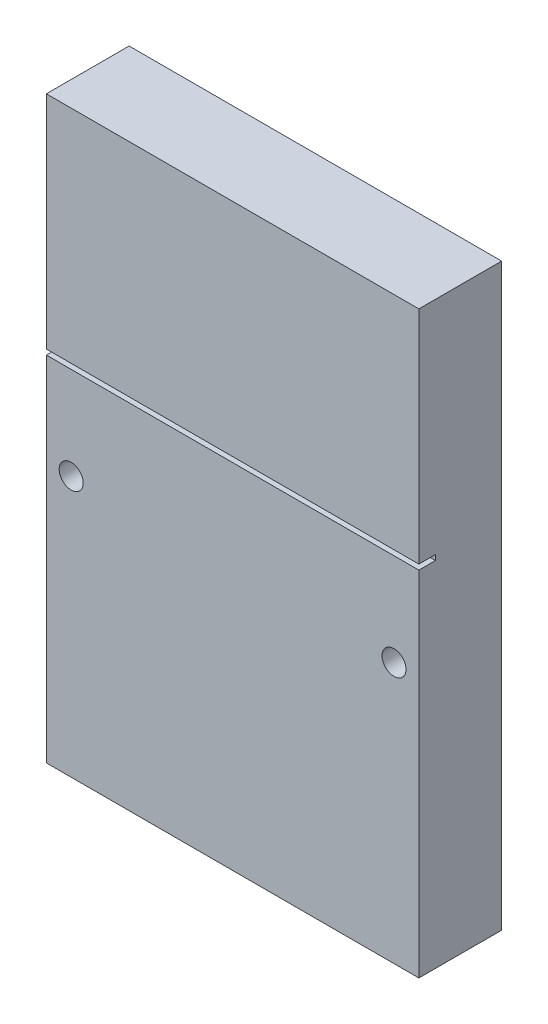
ISO-10303-21;
HEADER;
FILE_DESCRIPTION(('STEP AP214'),'2;1');
FILE_NAME('part.step','',(''),(''),'','','');
FILE_SCHEMA(('AUTOMOTIVE_DESIGN { 1 0 10303 214 1 1 1 1 }'));
ENDSEC;
DATA;
#1=APPLICATION_CONTEXT('core data for automotive mechanical design processes');
#2=APPLICATION_PROTOCOL_DEFINITION('international standard','automotive_design',2000,#1);
#3=PRODUCT_CONTEXT('',#1,'mechanical');
#4=PRODUCT('Part','Part','',(#3));
#5=PRODUCT_RELATED_PRODUCT_CATEGORY('part','',(#4));
#6=PRODUCT_DEFINITION_FORMATION('','',#4);
#7=PRODUCT_DEFINITION_CONTEXT('part definition',#1,'design');
#8=PRODUCT_DEFINITION('design','',#6,#7);
#9=PRODUCT_DEFINITION_SHAPE('','',#8);
#10=(LENGTH_UNIT() NAMED_UNIT(*) SI_UNIT(.MILLI.,.METRE.));
#11=(NAMED_UNIT(*) PLANE_ANGLE_UNIT() SI_UNIT($,.RADIAN.));
#12=(NAMED_UNIT(*) SI_UNIT($,.STERADIAN.) SOLID_ANGLE_UNIT());
#13=UNCERTAINTY_MEASURE_WITH_UNIT(LENGTH_MEASURE(1.E-05),#10,'distance_accuracy_value','');
#14=(GEOMETRIC_REPRESENTATION_CONTEXT(3) GLOBAL_UNCERTAINTY_ASSIGNED_CONTEXT((#13)) GLOBAL_UNIT_ASSIGNED_CONTEXT((#10,
#11,#12)) REPRESENTATION_CONTEXT('',''));
#15=CARTESIAN_POINT('',(0.,0.,0.));
#16=DIRECTION('',(0.,0.,1.));
#17=DIRECTION('',(1.,0.,0.));
#18=AXIS2_PLACEMENT_3D('',#15,#16,#17);
#19=CARTESIAN_POINT('',(22.5,40.,5.));
#20=DIRECTION('',(0.,0.,-1.));
#21=DIRECTION('',(-1.,0.,0.));
#22=AXIS2_PLACEMENT_3D('',#19,#20,#21);
#23=PLANE('',#22);
#24=DIRECTION('',(0.,-1.,0.));
#25=VECTOR('',#24,1.);
#26=CARTESIAN_POINT('',(-22.5,40.,5.00000000000001));
#27=LINE('',#26,#25);
#28=CARTESIAN_POINT('',(-22.5,50.,5.));
#29=VERTEX_POINT('',#28);
#30=CARTESIAN_POINT('',(-22.5,23.2974929319475,5.));
#31=VERTEX_POINT('',#30);
#32=EDGE_CURVE('E11',#29,#31,#27,.T.);
#33=ORIENTED_EDGE('',*,*,#32,.T.);
#34=DIRECTION('',(-1.,0.,0.));
#35=VECTOR('',#34,1.);
#36=CARTESIAN_POINT('',(-22.5,23.2974929319475,5.));
#37=LINE('',#36,#35);
#38=CARTESIAN_POINT('',(22.5,23.2974929319475,5.));
#39=VERTEX_POINT('',#38);
#40=EDGE_CURVE('E124',#39,#31,#37,.T.);
#41=ORIENTED_EDGE('',*,*,#40,.F.);
#42=DIRECTION('',(0.,-1.,0.));
#43=VECTOR('',#42,1.);
#44=CARTESIAN_POINT('',(22.5,40.,5.));
#45=LINE('',#44,#43);
#46=CARTESIAN_POINT('',(22.5,50.,5.));
#47=VERTEX_POINT('',#46);
#48=EDGE_CURVE('E169',#47,#39,#45,.T.);
#49=ORIENTED_EDGE('',*,*,#48,.F.);
#50=DIRECTION('',(1.,0.,0.));
#51=VECTOR('',#50,1.);
#52=CARTESIAN_POINT('',(-22.5,50.,5.));
#53=LINE('',#52,#51);
#54=EDGE_CURVE('E157',#29,#47,#53,.T.);
#55=ORIENTED_EDGE('',*,*,#54,.F.);
#56=EDGE_LOOP('',(#33,#41,#49,#55));
#57=FACE_BOUND('',#56,.T.);
#58=ADVANCED_FACE('F41',(#57),#23,.F.);
#59=CARTESIAN_POINT('',(-22.5,40.,-4.99999999999999));
#60=DIRECTION('',(1.,0.,0.));
#61=DIRECTION('',(0.,0.,-1.));
#62=AXIS2_PLACEMENT_3D('',#59,#60,#61);
#63=PLANE('',#62);
#64=DIRECTION('',(0.,-1.,0.));
#65=VECTOR('',#64,1.);
#66=CARTESIAN_POINT('',(-22.5,23.2974929319475,3.));
#67=LINE('',#66,#65);
#68=CARTESIAN_POINT('',(-22.5,23.2974929319475,3.));
#69=VERTEX_POINT('',#68);
#70=CARTESIAN_POINT('',(-22.5,22.6713275749144,3.));
#71=VERTEX_POINT('',#70);
#72=EDGE_CURVE('E115',#69,#71,#67,.T.);
#73=ORIENTED_EDGE('',*,*,#72,.F.);
#74=DIRECTION('',(0.,0.,1.));
#75=VECTOR('',#74,1.);
#76=CARTESIAN_POINT('',(-22.5,23.2974929319475,3.));
#77=LINE('',#76,#75);
#78=EDGE_CURVE('E141',#69,#31,#77,.T.);
#79=ORIENTED_EDGE('',*,*,#78,.T.);
#80=ORIENTED_EDGE('',*,*,#32,.F.);
#81=DIRECTION('',(0.,0.,1.));
#82=VECTOR('',#81,1.);
#83=CARTESIAN_POINT('',(-22.5,50.,-4.99999999999999));
#84=LINE('',#83,#82);
#85=CARTESIAN_POINT('',(-22.5,50.,-4.99999999999999));
#86=VERTEX_POINT('',#85);
#87=EDGE_CURVE('E154',#86,#29,#84,.T.);
#88=ORIENTED_EDGE('',*,*,#87,.F.);
#89=DIRECTION('',(0.,-1.,0.));
#90=VECTOR('',#89,1.);
#91=CARTESIAN_POINT('',(-22.5,40.,-4.99999999999999));
#92=LINE('',#91,#90);
#93=CARTESIAN_POINT('',(-22.5,-20.,-5.));
#94=VERTEX_POINT('',#93);
#95=EDGE_CURVE('E66',#86,#94,#92,.T.);
#96=ORIENTED_EDGE('',*,*,#95,.T.);
#97=DIRECTION('',(0.,0.,-1.));
#98=VECTOR('',#97,1.);
#99=CARTESIAN_POINT('',(-22.5,-20.,5.00000000000001));
#100=LINE('',#99,#98);
#101=CARTESIAN_POINT('',(-22.5,-20.,5.00000000000001));
#102=VERTEX_POINT('',#101);
#103=EDGE_CURVE('E142',#102,#94,#100,.T.);
#104=ORIENTED_EDGE('',*,*,#103,.F.);
#105=CARTESIAN_POINT('',(-22.5,22.6713275749144,5.));
#106=VERTEX_POINT('',#105);
#107=EDGE_CURVE('E50',#106,#102,#27,.T.);
#108=ORIENTED_EDGE('',*,*,#107,.F.);
#109=DIRECTION('',(0.,0.,1.));
#110=VECTOR('',#109,1.);
#111=CARTESIAN_POINT('',(-22.5,22.6713275749144,3.));
#112=LINE('',#111,#110);
#113=EDGE_CURVE('E109',#71,#106,#112,.T.);
#114=ORIENTED_EDGE('',*,*,#113,.F.);
#115=EDGE_LOOP('',(#73,#79,#80,#88,#96,#104,#108,#114));
#116=FACE_BOUND('',#115,.T.);
#117=ADVANCED_FACE('F43',(#116),#63,.F.);
#118=CARTESIAN_POINT('',(19.5,11.5,5.));
#119=DIRECTION('',(0.,0.,1.));
#120=DIRECTION('',(1.,0.,0.));
#121=AXIS2_PLACEMENT_3D('',#118,#119,#120);
#122=CIRCLE('',#121,1.45);
#123=CARTESIAN_POINT('',(20.95,11.5,5.));
#124=VERTEX_POINT('',#123);
#125=EDGE_CURVE('E134',#124,#124,#122,.T.);
#126=ORIENTED_EDGE('',*,*,#125,.F.);
#127=EDGE_LOOP('',(#126));
#128=FACE_BOUND('',#127,.T.);
#129=CARTESIAN_POINT('',(-19.5,11.5,5.));
#130=DIRECTION('',(0.,0.,1.));
#131=DIRECTION('',(1.,0.,0.));
#132=AXIS2_PLACEMENT_3D('',#129,#130,#131);
#133=CIRCLE('',#132,1.45);
#134=CARTESIAN_POINT('',(-18.05,11.5,5.));
#135=VERTEX_POINT('',#134);
#136=EDGE_CURVE('E138',#135,#135,#133,.T.);
#137=ORIENTED_EDGE('',*,*,#136,.F.);
#138=EDGE_LOOP('',(#137));
#139=FACE_BOUND('',#138,.T.);
#140=CARTESIAN_POINT('',(22.5,22.6713275749144,5.));
#141=VERTEX_POINT('',#140);
#142=CARTESIAN_POINT('',(22.5,-20.,5.00000000000001));
#143=VERTEX_POINT('',#142);
#144=EDGE_CURVE('E168',#141,#143,#45,.T.);
#145=ORIENTED_EDGE('',*,*,#144,.F.);
#146=DIRECTION('',(1.,0.,0.));
#147=VECTOR('',#146,1.);
#148=CARTESIAN_POINT('',(-22.5,22.6713275749144,5.));
#149=LINE('',#148,#147);
#150=EDGE_CURVE('E215',#106,#141,#149,.T.);
#151=ORIENTED_EDGE('',*,*,#150,.F.);
#152=ORIENTED_EDGE('',*,*,#107,.T.);
#153=DIRECTION('',(-1.,0.,0.));
#154=VECTOR('',#153,1.);
#155=CARTESIAN_POINT('',(-22.5,-20.,5.00000000000001));
#156=LINE('',#155,#154);
#157=EDGE_CURVE('E151',#143,#102,#156,.T.);
#158=ORIENTED_EDGE('',*,*,#157,.F.);
#159=EDGE_LOOP('',(#145,#151,#152,#158));
#160=FACE_BOUND('',#159,.T.);
#161=ADVANCED_FACE('F197',(#128,#139,#160),#23,.F.);
#162=CARTESIAN_POINT('',(22.5,40.,-5.));
#163=DIRECTION('',(-1.,0.,0.));
#164=DIRECTION('',(0.,0.,1.));
#165=AXIS2_PLACEMENT_3D('',#162,#163,#164);
#166=PLANE('',#165);
#167=ORIENTED_EDGE('',*,*,#48,.T.);
#168=DIRECTION('',(0.,0.,1.));
#169=VECTOR('',#168,1.);
#170=CARTESIAN_POINT('',(22.5,23.2974929319475,3.));
#171=LINE('',#170,#169);
#172=CARTESIAN_POINT('',(22.5,23.2974929319475,3.));
#173=VERTEX_POINT('',#172);
#174=EDGE_CURVE('E129',#173,#39,#171,.T.);
#175=ORIENTED_EDGE('',*,*,#174,.F.);
#176=DIRECTION('',(0.,1.,0.));
#177=VECTOR('',#176,1.);
#178=CARTESIAN_POINT('',(22.5,23.2974929319475,3.));
#179=LINE('',#178,#177);
#180=CARTESIAN_POINT('',(22.5,22.6713275749144,3.));
#181=VERTEX_POINT('',#180);
#182=EDGE_CURVE('E114',#181,#173,#179,.T.);
#183=ORIENTED_EDGE('',*,*,#182,.F.);
#184=DIRECTION('',(0.,0.,1.));
#185=VECTOR('',#184,1.);
#186=CARTESIAN_POINT('',(22.5,22.6713275749144,3.));
#187=LINE('',#186,#185);
#188=EDGE_CURVE('E112',#181,#141,#187,.T.);
#189=ORIENTED_EDGE('',*,*,#188,.T.);
#190=ORIENTED_EDGE('',*,*,#144,.T.);
#191=DIRECTION('',(0.,0.,1.));
#192=VECTOR('',#191,1.);
#193=CARTESIAN_POINT('',(22.5,-20.,5.00000000000001));
#194=LINE('',#193,#192);
#195=CARTESIAN_POINT('',(22.5,-20.,-5.));
#196=VERTEX_POINT('',#195);
#197=EDGE_CURVE('E148',#196,#143,#194,.T.);
#198=ORIENTED_EDGE('',*,*,#197,.F.);
#199=DIRECTION('',(0.,-1.,0.));
#200=VECTOR('',#199,1.);
#201=CARTESIAN_POINT('',(22.5,40.,-5.));
#202=LINE('',#201,#200);
#203=CARTESIAN_POINT('',(22.5,50.,-4.99999999999999));
#204=VERTEX_POINT('',#203);
#205=EDGE_CURVE('E166',#204,#196,#202,.T.);
#206=ORIENTED_EDGE('',*,*,#205,.F.);
#207=DIRECTION('',(0.,0.,-1.));
#208=VECTOR('',#207,1.);
#209=CARTESIAN_POINT('',(22.5,50.,-4.99999999999999));
#210=LINE('',#209,#208);
#211=EDGE_CURVE('E160',#47,#204,#210,.T.);
#212=ORIENTED_EDGE('',*,*,#211,.F.);
#213=EDGE_LOOP('',(#167,#175,#183,#189,#190,#198,#206,#212));
#214=FACE_BOUND('',#213,.T.);
#215=ADVANCED_FACE('F203',(#214),#166,.F.);
#216=CARTESIAN_POINT('',(22.5,40.,-5.));
#217=DIRECTION('',(0.,0.,1.));
#218=DIRECTION('',(1.,0.,0.));
#219=AXIS2_PLACEMENT_3D('',#216,#217,#218);
#220=PLANE('',#219);
#221=CARTESIAN_POINT('',(19.5,11.5,-5.));
#222=DIRECTION('',(0.,0.,1.));
#223=DIRECTION('',(1.,0.,0.));
#224=AXIS2_PLACEMENT_3D('',#221,#222,#223);
#225=CIRCLE('',#224,1.45);
#226=CARTESIAN_POINT('',(20.95,11.5,-5.));
#227=VERTEX_POINT('',#226);
#228=EDGE_CURVE('E45',#227,#227,#225,.T.);
#229=ORIENTED_EDGE('',*,*,#228,.T.);
#230=EDGE_LOOP('',(#229));
#231=FACE_BOUND('',#230,.T.);
#232=CARTESIAN_POINT('',(-19.5,11.5,-4.99999999999999));
#233=DIRECTION('',(0.,0.,1.));
#234=DIRECTION('',(1.,0.,0.));
#235=AXIS2_PLACEMENT_3D('',#232,#233,#234);
#236=CIRCLE('',#235,1.45);
#237=CARTESIAN_POINT('',(-18.05,11.5,-4.99999999999999));
#238=VERTEX_POINT('',#237);
#239=EDGE_CURVE('E137',#238,#238,#236,.T.);
#240=ORIENTED_EDGE('',*,*,#239,.T.);
#241=EDGE_LOOP('',(#240));
#242=FACE_BOUND('',#241,.T.);
#243=ORIENTED_EDGE('',*,*,#205,.T.);
#244=DIRECTION('',(1.,0.,0.));
#245=VECTOR('',#244,1.);
#246=CARTESIAN_POINT('',(-22.5,-20.,-5.));
#247=LINE('',#246,#245);
#248=EDGE_CURVE('E145',#94,#196,#247,.T.);
#249=ORIENTED_EDGE('',*,*,#248,.F.);
#250=ORIENTED_EDGE('',*,*,#95,.F.);
#251=DIRECTION('',(-1.,0.,0.));
#252=VECTOR('',#251,1.);
#253=CARTESIAN_POINT('',(-22.5,50.,-4.99999999999999));
#254=LINE('',#253,#252);
#255=EDGE_CURVE('E163',#204,#86,#254,.T.);
#256=ORIENTED_EDGE('',*,*,#255,.F.);
#257=EDGE_LOOP('',(#243,#249,#250,#256));
#258=FACE_BOUND('',#257,.T.);
#259=ADVANCED_FACE('F177',(#231,#242,#258),#220,.F.);
#260=CARTESIAN_POINT('',(0.,50.,0.));
#261=DIRECTION('',(0.,1.,0.));
#262=DIRECTION('',(0.,0.,1.));
#263=AXIS2_PLACEMENT_3D('',#260,#261,#262);
#264=PLANE('',#263);
#265=ORIENTED_EDGE('',*,*,#87,.T.);
#266=ORIENTED_EDGE('',*,*,#54,.T.);
#267=ORIENTED_EDGE('',*,*,#211,.T.);
#268=ORIENTED_EDGE('',*,*,#255,.T.);
#269=EDGE_LOOP('',(#265,#266,#267,#268));
#270=FACE_BOUND('',#269,.T.);
#271=ADVANCED_FACE('F220',(#270),#264,.T.);
#272=CARTESIAN_POINT('',(0.,-20.,0.));
#273=DIRECTION('',(0.,-1.,0.));
#274=DIRECTION('',(0.,0.,-1.));
#275=AXIS2_PLACEMENT_3D('',#272,#273,#274);
#276=PLANE('',#275);
#277=ORIENTED_EDGE('',*,*,#103,.T.);
#278=ORIENTED_EDGE('',*,*,#248,.T.);
#279=ORIENTED_EDGE('',*,*,#197,.T.);
#280=ORIENTED_EDGE('',*,*,#157,.T.);
#281=EDGE_LOOP('',(#277,#278,#279,#280));
#282=FACE_BOUND('',#281,.T.);
#283=ADVANCED_FACE('F192',(#282),#276,.T.);
#284=CARTESIAN_POINT('',(-19.5,11.5,-15.));
#285=DIRECTION('',(0.,0.,1.));
#286=DIRECTION('',(1.,0.,0.));
#287=AXIS2_PLACEMENT_3D('',#284,#285,#286);
#288=CYLINDRICAL_SURFACE('',#287,1.45);
#289=ORIENTED_EDGE('',*,*,#136,.T.);
#290=EDGE_LOOP('',(#289));
#291=FACE_BOUND('',#290,.T.);
#292=ORIENTED_EDGE('',*,*,#239,.F.);
#293=EDGE_LOOP('',(#292));
#294=FACE_BOUND('',#293,.T.);
#295=ADVANCED_FACE('F182',(#291,#294),#288,.F.);
#296=CARTESIAN_POINT('',(19.5,11.5,-15.));
#297=DIRECTION('',(0.,0.,1.));
#298=DIRECTION('',(1.,0.,0.));
#299=AXIS2_PLACEMENT_3D('',#296,#297,#298);
#300=CYLINDRICAL_SURFACE('',#299,1.45);
#301=ORIENTED_EDGE('',*,*,#125,.T.);
#302=EDGE_LOOP('',(#301));
#303=FACE_BOUND('',#302,.T.);
#304=ORIENTED_EDGE('',*,*,#228,.F.);
#305=EDGE_LOOP('',(#304));
#306=FACE_BOUND('',#305,.T.);
#307=ADVANCED_FACE('F179',(#303,#306),#300,.F.);
#308=CARTESIAN_POINT('',(-22.5,23.2974929319475,3.));
#309=DIRECTION('',(0.,1.,0.));
#310=DIRECTION('',(0.,0.,1.));
#311=AXIS2_PLACEMENT_3D('',#308,#309,#310);
#312=PLANE('',#311);
#313=ORIENTED_EDGE('',*,*,#40,.T.);
#314=ORIENTED_EDGE('',*,*,#78,.F.);
#315=DIRECTION('',(-1.,0.,0.));
#316=VECTOR('',#315,1.);
#317=CARTESIAN_POINT('',(-22.5,23.2974929319475,3.));
#318=LINE('',#317,#316);
#319=EDGE_CURVE('E121',#173,#69,#318,.T.);
#320=ORIENTED_EDGE('',*,*,#319,.F.);
#321=ORIENTED_EDGE('',*,*,#174,.T.);
#322=EDGE_LOOP('',(#313,#314,#320,#321));
#323=FACE_BOUND('',#322,.T.);
#324=ADVANCED_FACE('F181',(#323),#312,.F.);
#325=CARTESIAN_POINT('',(-22.5,22.6713275749144,3.));
#326=DIRECTION('',(0.,-1.,0.));
#327=DIRECTION('',(0.,0.,-1.));
#328=AXIS2_PLACEMENT_3D('',#325,#326,#327);
#329=PLANE('',#328);
#330=ORIENTED_EDGE('',*,*,#150,.T.);
#331=ORIENTED_EDGE('',*,*,#188,.F.);
#332=DIRECTION('',(1.,0.,0.));
#333=VECTOR('',#332,1.);
#334=CARTESIAN_POINT('',(-22.5,22.6713275749144,3.));
#335=LINE('',#334,#333);
#336=EDGE_CURVE('E58',#71,#181,#335,.T.);
#337=ORIENTED_EDGE('',*,*,#336,.F.);
#338=ORIENTED_EDGE('',*,*,#113,.T.);
#339=EDGE_LOOP('',(#330,#331,#337,#338));
#340=FACE_BOUND('',#339,.T.);
#341=ADVANCED_FACE('F107',(#340),#329,.F.);
#342=CARTESIAN_POINT('',(0.,0.,3.));
#343=DIRECTION('',(0.,0.,1.));
#344=DIRECTION('',(1.,0.,0.));
#345=AXIS2_PLACEMENT_3D('',#342,#343,#344);
#346=PLANE('',#345);
#347=ORIENTED_EDGE('',*,*,#72,.T.);
#348=ORIENTED_EDGE('',*,*,#336,.T.);
#349=ORIENTED_EDGE('',*,*,#182,.T.);
#350=ORIENTED_EDGE('',*,*,#319,.T.);
#351=EDGE_LOOP('',(#347,#348,#349,#350));
#352=FACE_BOUND('',#351,.T.);
#353=ADVANCED_FACE('F119',(#352),#346,.T.);
#354=CLOSED_SHELL('',(#58,#117,#161,#215,#259,#271,#283,#295,#307,#324,#341,#353));
#355=MANIFOLD_SOLID_BREP('B2',#354);
#356=ADVANCED_BREP_SHAPE_REPRESENTATION('',(#18,#355),#14);
#357=SHAPE_DEFINITION_REPRESENTATION(#9,#356);
ENDSEC;
END-ISO-10303-21;
